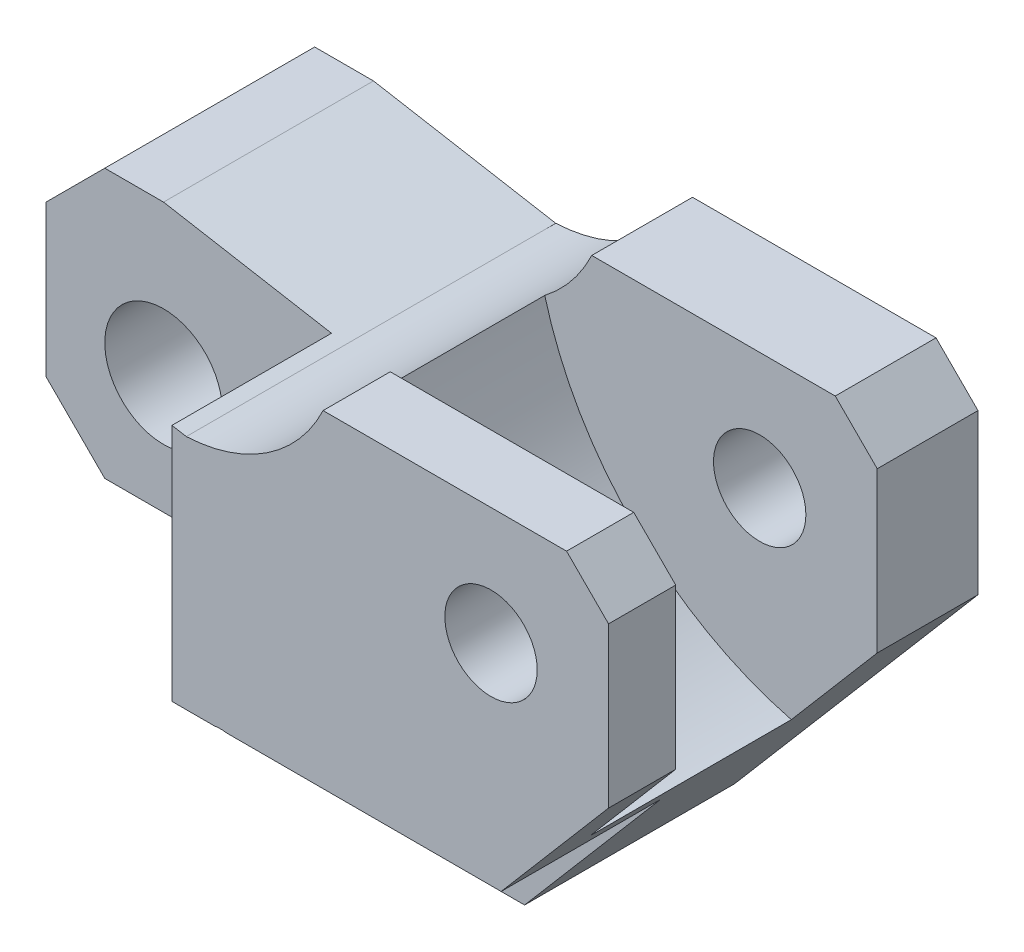
ISO-10303-21;
HEADER;
FILE_DESCRIPTION(('STEP AP214'),'2;1');
FILE_NAME('part.step','',(''),(''),'','','');
FILE_SCHEMA(('AUTOMOTIVE_DESIGN { 1 0 10303 214 1 1 1 1 }'));
ENDSEC;
DATA;
#1=APPLICATION_CONTEXT('core data for automotive mechanical design processes');
#2=APPLICATION_PROTOCOL_DEFINITION('international standard','automotive_design',2000,#1);
#3=PRODUCT_CONTEXT('',#1,'mechanical');
#4=PRODUCT('Part','Part','',(#3));
#5=PRODUCT_RELATED_PRODUCT_CATEGORY('part','',(#4));
#6=PRODUCT_DEFINITION_FORMATION('','',#4);
#7=PRODUCT_DEFINITION_CONTEXT('part definition',#1,'design');
#8=PRODUCT_DEFINITION('design','',#6,#7);
#9=PRODUCT_DEFINITION_SHAPE('','',#8);
#10=(LENGTH_UNIT() NAMED_UNIT(*) SI_UNIT(.MILLI.,.METRE.));
#11=(NAMED_UNIT(*) PLANE_ANGLE_UNIT() SI_UNIT($,.RADIAN.));
#12=(NAMED_UNIT(*) SI_UNIT($,.STERADIAN.) SOLID_ANGLE_UNIT());
#13=UNCERTAINTY_MEASURE_WITH_UNIT(LENGTH_MEASURE(1.E-05),#10,'distance_accuracy_value','');
#14=(GEOMETRIC_REPRESENTATION_CONTEXT(3) GLOBAL_UNCERTAINTY_ASSIGNED_CONTEXT((#13)) GLOBAL_UNIT_ASSIGNED_CONTEXT((#10,
#11,#12)) REPRESENTATION_CONTEXT('',''));
#15=CARTESIAN_POINT('',(0.,0.,0.));
#16=DIRECTION('',(0.,0.,1.));
#17=DIRECTION('',(1.,0.,0.));
#18=AXIS2_PLACEMENT_3D('',#15,#16,#17);
#19=CARTESIAN_POINT('',(103.05549886231,46.2876532524772,12.));
#20=DIRECTION('',(0.,0.,1.));
#21=DIRECTION('',(1.,0.,0.));
#22=AXIS2_PLACEMENT_3D('',#19,#20,#21);
#23=CYLINDRICAL_SURFACE('',#22,41.);
#24=CARTESIAN_POINT('',(103.05549886231,46.2876532524772,36.));
#25=DIRECTION('',(0.,0.,1.));
#26=DIRECTION('',(1.,0.,0.));
#27=AXIS2_PLACEMENT_3D('',#24,#25,#26);
#28=CIRCLE('',#27,41.);
#29=CARTESIAN_POINT('',(63.4564241142946,35.6615872306088,36.));
#30=VERTEX_POINT('',#29);
#31=CARTESIAN_POINT('',(92.8202047446628,6.58577981651378,36.));
#32=VERTEX_POINT('',#31);
#33=EDGE_CURVE('E57',#30,#32,#28,.T.);
#34=ORIENTED_EDGE('',*,*,#33,.T.);
#35=DIRECTION('',(0.,0.,1.));
#36=VECTOR('',#35,1.);
#37=CARTESIAN_POINT('',(92.8202047446628,6.58577981651378,12.));
#38=LINE('',#37,#36);
#39=CARTESIAN_POINT('',(92.8202047446628,6.58577981651378,12.));
#40=VERTEX_POINT('',#39);
#41=EDGE_CURVE('E220',#40,#32,#38,.T.);
#42=ORIENTED_EDGE('',*,*,#41,.F.);
#43=CARTESIAN_POINT('',(103.05549886231,46.2876532524772,12.));
#44=DIRECTION('',(0.,0.,1.));
#45=DIRECTION('',(1.,0.,0.));
#46=AXIS2_PLACEMENT_3D('',#43,#44,#45);
#47=CIRCLE('',#46,41.);
#48=CARTESIAN_POINT('',(63.4564241142946,35.6615872306088,12.));
#49=VERTEX_POINT('',#48);
#50=EDGE_CURVE('E247',#49,#40,#47,.T.);
#51=ORIENTED_EDGE('',*,*,#50,.F.);
#52=DIRECTION('',(0.,0.,1.));
#53=VECTOR('',#52,1.);
#54=CARTESIAN_POINT('',(63.4564241142946,35.6615872306088,12.));
#55=LINE('',#54,#53);
#56=EDGE_CURVE('E53',#49,#30,#55,.T.);
#57=ORIENTED_EDGE('',*,*,#56,.T.);
#58=EDGE_LOOP('',(#34,#42,#51,#57));
#59=FACE_BOUND('',#58,.T.);
#60=ADVANCED_FACE('F36',(#59),#23,.F.);
#61=CARTESIAN_POINT('',(103.05549886231,37.5857798165138,44.));
#62=DIRECTION('',(-1.,0.,0.));
#63=DIRECTION('',(0.,0.,1.));
#64=AXIS2_PLACEMENT_3D('',#61,#62,#63);
#65=PLANE('',#64);
#66=DIRECTION('',(0.,1.,0.));
#67=VECTOR('',#66,1.);
#68=CARTESIAN_POINT('',(103.05549886231,37.5857798165138,12.));
#69=LINE('',#68,#67);
#70=CARTESIAN_POINT('',(103.05549886231,18.5857798165138,12.));
#71=VERTEX_POINT('',#70);
#72=CARTESIAN_POINT('',(103.05549886231,37.5857798165138,12.));
#73=VERTEX_POINT('',#72);
#74=EDGE_CURVE('E252',#71,#73,#69,.T.);
#75=ORIENTED_EDGE('',*,*,#74,.F.);
#76=DIRECTION('',(0.,0.,-1.));
#77=VECTOR('',#76,1.);
#78=CARTESIAN_POINT('',(103.05549886231,18.5857798165138,44.));
#79=LINE('',#78,#77);
#80=CARTESIAN_POINT('',(103.05549886231,18.5857798165138,0.));
#81=VERTEX_POINT('',#80);
#82=EDGE_CURVE('E382',#71,#81,#79,.T.);
#83=ORIENTED_EDGE('',*,*,#82,.T.);
#84=DIRECTION('',(0.,1.,0.));
#85=VECTOR('',#84,1.);
#86=CARTESIAN_POINT('',(103.05549886231,37.5857798165138,0.));
#87=LINE('',#86,#85);
#88=CARTESIAN_POINT('',(103.05549886231,37.5857798165138,0.));
#89=VERTEX_POINT('',#88);
#90=EDGE_CURVE('E334',#81,#89,#87,.T.);
#91=ORIENTED_EDGE('',*,*,#90,.T.);
#92=DIRECTION('',(0.,0.,-1.));
#93=VECTOR('',#92,1.);
#94=CARTESIAN_POINT('',(103.05549886231,37.5857798165138,44.));
#95=LINE('',#94,#93);
#96=EDGE_CURVE('E380',#73,#89,#95,.T.);
#97=ORIENTED_EDGE('',*,*,#96,.F.);
#98=EDGE_LOOP('',(#75,#83,#91,#97));
#99=FACE_BOUND('',#98,.T.);
#100=ADVANCED_FACE('F414',(#99),#65,.F.);
#101=CARTESIAN_POINT('',(98.0554988623098,42.5857798165138,44.));
#102=DIRECTION('',(-0.707106781186544,-0.707106781186551,0.));
#103=DIRECTION('',(0.707106781186551,-0.707106781186544,0.));
#104=AXIS2_PLACEMENT_3D('',#101,#102,#103);
#105=PLANE('',#104);
#106=DIRECTION('',(-0.707106781186551,0.707106781186544,0.));
#107=VECTOR('',#106,1.);
#108=CARTESIAN_POINT('',(98.0554988623098,42.5857798165138,12.));
#109=LINE('',#108,#107);
#110=CARTESIAN_POINT('',(98.0554988623098,42.5857798165138,12.));
#111=VERTEX_POINT('',#110);
#112=EDGE_CURVE('E254',#73,#111,#109,.T.);
#113=ORIENTED_EDGE('',*,*,#112,.F.);
#114=ORIENTED_EDGE('',*,*,#96,.T.);
#115=DIRECTION('',(-0.707106781186551,0.707106781186544,0.));
#116=VECTOR('',#115,1.);
#117=CARTESIAN_POINT('',(98.0554988623098,42.5857798165138,0.));
#118=LINE('',#117,#116);
#119=CARTESIAN_POINT('',(98.0554988623098,42.5857798165138,0.));
#120=VERTEX_POINT('',#119);
#121=EDGE_CURVE('E337',#89,#120,#118,.T.);
#122=ORIENTED_EDGE('',*,*,#121,.T.);
#123=DIRECTION('',(0.,0.,-1.));
#124=VECTOR('',#123,1.);
#125=CARTESIAN_POINT('',(98.0554988623098,42.5857798165138,44.));
#126=LINE('',#125,#124);
#127=EDGE_CURVE('E378',#111,#120,#126,.T.);
#128=ORIENTED_EDGE('',*,*,#127,.F.);
#129=EDGE_LOOP('',(#113,#114,#122,#128));
#130=FACE_BOUND('',#129,.T.);
#131=ADVANCED_FACE('F408',(#130),#105,.F.);
#132=CARTESIAN_POINT('',(69.0554988623098,42.5857798165138,44.));
#133=DIRECTION('',(0.,-1.,0.));
#134=DIRECTION('',(0.,0.,-1.));
#135=AXIS2_PLACEMENT_3D('',#132,#133,#134);
#136=PLANE('',#135);
#137=DIRECTION('',(-1.,0.,0.));
#138=VECTOR('',#137,1.);
#139=CARTESIAN_POINT('',(69.0554988623098,42.5857798165138,12.));
#140=LINE('',#139,#138);
#141=CARTESIAN_POINT('',(69.0554988623098,42.5857798165138,12.));
#142=VERTEX_POINT('',#141);
#143=EDGE_CURVE('E256',#111,#142,#140,.T.);
#144=ORIENTED_EDGE('',*,*,#143,.F.);
#145=ORIENTED_EDGE('',*,*,#127,.T.);
#146=DIRECTION('',(-1.,0.,0.));
#147=VECTOR('',#146,1.);
#148=CARTESIAN_POINT('',(69.0554988623098,42.5857798165138,0.));
#149=LINE('',#148,#147);
#150=CARTESIAN_POINT('',(69.0554988623098,42.5857798165138,0.));
#151=VERTEX_POINT('',#150);
#152=EDGE_CURVE('E340',#120,#151,#149,.T.);
#153=ORIENTED_EDGE('',*,*,#152,.T.);
#154=DIRECTION('',(0.,0.,-1.));
#155=VECTOR('',#154,1.);
#156=CARTESIAN_POINT('',(69.0554988623098,42.5857798165138,44.));
#157=LINE('',#156,#155);
#158=EDGE_CURVE('E376',#142,#151,#157,.T.);
#159=ORIENTED_EDGE('',*,*,#158,.F.);
#160=EDGE_LOOP('',(#144,#145,#153,#159));
#161=FACE_BOUND('',#160,.T.);
#162=ADVANCED_FACE('F398',(#161),#136,.F.);
#163=CARTESIAN_POINT('',(89.0554988623098,28.5857798165138,-6.00000000000001));
#164=DIRECTION('',(0.,0.,1.));
#165=DIRECTION('',(1.,0.,0.));
#166=AXIS2_PLACEMENT_3D('',#163,#164,#165);
#167=CYLINDRICAL_SURFACE('',#166,5.5);
#168=CARTESIAN_POINT('',(89.0554988623098,28.5857798165138,0.));
#169=DIRECTION('',(0.,0.,-1.));
#170=DIRECTION('',(-1.,0.,0.));
#171=AXIS2_PLACEMENT_3D('',#168,#169,#170);
#172=CIRCLE('',#171,5.5);
#173=CARTESIAN_POINT('',(83.5554988623098,28.5857798165138,0.));
#174=VERTEX_POINT('',#173);
#175=EDGE_CURVE('E280',#174,#174,#172,.T.);
#176=ORIENTED_EDGE('',*,*,#175,.T.);
#177=EDGE_LOOP('',(#176));
#178=FACE_BOUND('',#177,.T.);
#179=CARTESIAN_POINT('',(89.0554988623098,28.5857798165138,12.));
#180=DIRECTION('',(0.,0.,1.));
#181=DIRECTION('',(1.,0.,0.));
#182=AXIS2_PLACEMENT_3D('',#179,#180,#181);
#183=CIRCLE('',#182,5.5);
#184=CARTESIAN_POINT('',(94.5554988623098,28.5857798165138,12.));
#185=VERTEX_POINT('',#184);
#186=EDGE_CURVE('E259',#185,#185,#183,.F.);
#187=ORIENTED_EDGE('',*,*,#186,.F.);
#188=EDGE_LOOP('',(#187));
#189=FACE_BOUND('',#188,.T.);
#190=ADVANCED_FACE('F395',(#178,#189),#167,.F.);
#191=CARTESIAN_POINT('',(31.0554988623098,35.5857798165138,44.));
#192=DIRECTION('',(0.,-1.,0.));
#193=DIRECTION('',(0.,0.,-1.));
#194=AXIS2_PLACEMENT_3D('',#191,#192,#193);
#195=PLANE('',#194);
#196=DIRECTION('',(-1.,0.,0.));
#197=VECTOR('',#196,1.);
#198=CARTESIAN_POINT('',(31.0554988623098,35.5857798165138,25.));
#199=LINE('',#198,#197);
#200=CARTESIAN_POINT('',(31.0554988623098,35.5857798165138,25.));
#201=VERTEX_POINT('',#200);
#202=CARTESIAN_POINT('',(24.0554988623098,35.5857798165138,25.));
#203=VERTEX_POINT('',#202);
#204=EDGE_CURVE('E296',#201,#203,#199,.T.);
#205=ORIENTED_EDGE('',*,*,#204,.F.);
#206=DIRECTION('',(0.,0.,-1.));
#207=VECTOR('',#206,1.);
#208=CARTESIAN_POINT('',(31.0554988623098,35.5857798165138,44.));
#209=LINE('',#208,#207);
#210=CARTESIAN_POINT('',(31.0554988623098,35.5857798165138,0.));
#211=VERTEX_POINT('',#210);
#212=EDGE_CURVE('E371',#201,#211,#209,.T.);
#213=ORIENTED_EDGE('',*,*,#212,.T.);
#214=DIRECTION('',(-1.,0.,0.));
#215=VECTOR('',#214,1.);
#216=CARTESIAN_POINT('',(31.0554988623098,35.5857798165138,0.));
#217=LINE('',#216,#215);
#218=CARTESIAN_POINT('',(24.0554988623098,35.5857798165138,0.));
#219=VERTEX_POINT('',#218);
#220=EDGE_CURVE('E348',#211,#219,#217,.T.);
#221=ORIENTED_EDGE('',*,*,#220,.T.);
#222=DIRECTION('',(0.,0.,-1.));
#223=VECTOR('',#222,1.);
#224=CARTESIAN_POINT('',(24.0554988623098,35.5857798165138,44.));
#225=LINE('',#224,#223);
#226=EDGE_CURVE('E369',#203,#219,#225,.T.);
#227=ORIENTED_EDGE('',*,*,#226,.F.);
#228=EDGE_LOOP('',(#205,#213,#221,#227));
#229=FACE_BOUND('',#228,.T.);
#230=ADVANCED_FACE('F397',(#229),#195,.F.);
#231=CARTESIAN_POINT('',(24.0554988623098,35.5857798165138,44.));
#232=DIRECTION('',(0.707106781186547,-0.707106781186548,0.));
#233=DIRECTION('',(0.707106781186548,0.707106781186547,0.));
#234=AXIS2_PLACEMENT_3D('',#231,#232,#233);
#235=PLANE('',#234);
#236=DIRECTION('',(-0.707106781186548,-0.707106781186547,0.));
#237=VECTOR('',#236,1.);
#238=CARTESIAN_POINT('',(24.0554988623098,35.5857798165138,25.));
#239=LINE('',#238,#237);
#240=CARTESIAN_POINT('',(17.0554988623098,28.5857798165138,25.));
#241=VERTEX_POINT('',#240);
#242=EDGE_CURVE('E281',#203,#241,#239,.T.);
#243=ORIENTED_EDGE('',*,*,#242,.F.);
#244=ORIENTED_EDGE('',*,*,#226,.T.);
#245=DIRECTION('',(-0.707106781186548,-0.707106781186547,0.));
#246=VECTOR('',#245,1.);
#247=CARTESIAN_POINT('',(24.0554988623098,35.5857798165138,0.));
#248=LINE('',#247,#246);
#249=CARTESIAN_POINT('',(17.0554988623098,28.5857798165138,0.));
#250=VERTEX_POINT('',#249);
#251=EDGE_CURVE('E351',#219,#250,#248,.T.);
#252=ORIENTED_EDGE('',*,*,#251,.T.);
#253=DIRECTION('',(0.,0.,-1.));
#254=VECTOR('',#253,1.);
#255=CARTESIAN_POINT('',(17.0554988623098,28.5857798165138,44.));
#256=LINE('',#255,#254);
#257=EDGE_CURVE('E367',#241,#250,#256,.T.);
#258=ORIENTED_EDGE('',*,*,#257,.F.);
#259=EDGE_LOOP('',(#243,#244,#252,#258));
#260=FACE_BOUND('',#259,.T.);
#261=ADVANCED_FACE('F405',(#260),#235,.F.);
#262=CARTESIAN_POINT('',(17.0554988623098,28.5857798165138,44.));
#263=DIRECTION('',(1.,0.,0.));
#264=DIRECTION('',(0.,0.,-1.));
#265=AXIS2_PLACEMENT_3D('',#262,#263,#264);
#266=PLANE('',#265);
#267=DIRECTION('',(0.,-1.,0.));
#268=VECTOR('',#267,1.);
#269=CARTESIAN_POINT('',(17.0554988623098,28.5857798165138,25.));
#270=LINE('',#269,#268);
#271=CARTESIAN_POINT('',(17.0554988623098,10.5857798165138,25.));
#272=VERTEX_POINT('',#271);
#273=EDGE_CURVE('E283',#241,#272,#270,.T.);
#274=ORIENTED_EDGE('',*,*,#273,.F.);
#275=ORIENTED_EDGE('',*,*,#257,.T.);
#276=DIRECTION('',(0.,-1.,0.));
#277=VECTOR('',#276,1.);
#278=CARTESIAN_POINT('',(17.0554988623098,28.5857798165138,0.));
#279=LINE('',#278,#277);
#280=CARTESIAN_POINT('',(17.0554988623098,10.5857798165138,0.));
#281=VERTEX_POINT('',#280);
#282=EDGE_CURVE('E354',#250,#281,#279,.T.);
#283=ORIENTED_EDGE('',*,*,#282,.T.);
#284=DIRECTION('',(0.,0.,-1.));
#285=VECTOR('',#284,1.);
#286=CARTESIAN_POINT('',(17.0554988623098,10.5857798165138,44.));
#287=LINE('',#286,#285);
#288=EDGE_CURVE('E365',#272,#281,#287,.T.);
#289=ORIENTED_EDGE('',*,*,#288,.F.);
#290=EDGE_LOOP('',(#274,#275,#283,#289));
#291=FACE_BOUND('',#290,.T.);
#292=ADVANCED_FACE('F526',(#291),#266,.F.);
#293=CARTESIAN_POINT('',(17.0554988623098,10.5857798165138,44.));
#294=DIRECTION('',(0.707106781186548,0.707106781186547,0.));
#295=DIRECTION('',(-0.707106781186547,0.707106781186548,0.));
#296=AXIS2_PLACEMENT_3D('',#293,#294,#295);
#297=PLANE('',#296);
#298=DIRECTION('',(0.707106781186547,-0.707106781186548,0.));
#299=VECTOR('',#298,1.);
#300=CARTESIAN_POINT('',(17.0554988623098,10.5857798165138,25.));
#301=LINE('',#300,#299);
#302=CARTESIAN_POINT('',(24.0554988623098,3.58577981651377,25.));
#303=VERTEX_POINT('',#302);
#304=EDGE_CURVE('E286',#272,#303,#301,.T.);
#305=ORIENTED_EDGE('',*,*,#304,.F.);
#306=ORIENTED_EDGE('',*,*,#288,.T.);
#307=DIRECTION('',(0.707106781186547,-0.707106781186548,0.));
#308=VECTOR('',#307,1.);
#309=CARTESIAN_POINT('',(17.0554988623098,10.5857798165138,0.));
#310=LINE('',#309,#308);
#311=CARTESIAN_POINT('',(24.0554988623098,3.58577981651377,0.));
#312=VERTEX_POINT('',#311);
#313=EDGE_CURVE('E357',#281,#312,#310,.T.);
#314=ORIENTED_EDGE('',*,*,#313,.T.);
#315=DIRECTION('',(0.,0.,-1.));
#316=VECTOR('',#315,1.);
#317=CARTESIAN_POINT('',(24.0554988623098,3.58577981651377,44.));
#318=LINE('',#317,#316);
#319=EDGE_CURVE('E363',#303,#312,#318,.T.);
#320=ORIENTED_EDGE('',*,*,#319,.F.);
#321=EDGE_LOOP('',(#305,#306,#314,#320));
#322=FACE_BOUND('',#321,.T.);
#323=ADVANCED_FACE('F523',(#322),#297,.F.);
#324=CARTESIAN_POINT('',(31.0554988623098,17.5857798165138,0.));
#325=DIRECTION('',(0.,0.,1.));
#326=DIRECTION('',(1.,0.,0.));
#327=AXIS2_PLACEMENT_3D('',#324,#325,#326);
#328=CYLINDRICAL_SURFACE('',#327,7.);
#329=CARTESIAN_POINT('',(31.0554988623098,17.5857798165138,0.));
#330=DIRECTION('',(0.,0.,1.));
#331=DIRECTION('',(1.,0.,0.));
#332=AXIS2_PLACEMENT_3D('',#329,#330,#331);
#333=CIRCLE('',#332,7.);
#334=CARTESIAN_POINT('',(38.0554988623098,17.5857798165138,0.));
#335=VERTEX_POINT('',#334);
#336=EDGE_CURVE('E305',#335,#335,#333,.T.);
#337=ORIENTED_EDGE('',*,*,#336,.F.);
#338=EDGE_LOOP('',(#337));
#339=FACE_BOUND('',#338,.T.);
#340=CARTESIAN_POINT('',(31.0554988623098,17.5857798165138,25.));
#341=DIRECTION('',(0.,0.,1.));
#342=DIRECTION('',(1.,0.,0.));
#343=AXIS2_PLACEMENT_3D('',#340,#341,#342);
#344=CIRCLE('',#343,7.);
#345=CARTESIAN_POINT('',(38.0554988623098,17.5857798165138,25.));
#346=VERTEX_POINT('',#345);
#347=EDGE_CURVE('E303',#346,#346,#344,.F.);
#348=ORIENTED_EDGE('',*,*,#347,.F.);
#349=EDGE_LOOP('',(#348));
#350=FACE_BOUND('',#349,.T.);
#351=ADVANCED_FACE('F520',(#339,#350),#328,.F.);
#352=CARTESIAN_POINT('',(56.8344819672813,-1.35316595380695,44.));
#353=DIRECTION('',(0.,0.,-1.));
#354=DIRECTION('',(-1.,0.,0.));
#355=AXIS2_PLACEMENT_3D('',#352,#353,#354);
#356=CYLINDRICAL_SURFACE('',#355,5.);
#357=CARTESIAN_POINT('',(56.8344819672813,-1.35316595380695,25.));
#358=DIRECTION('',(0.,0.,-1.));
#359=DIRECTION('',(-1.,0.,0.));
#360=AXIS2_PLACEMENT_3D('',#357,#358,#359);
#361=CIRCLE('',#360,5.);
#362=CARTESIAN_POINT('',(61.7971613747948,-1.96293074308323,25.));
#363=VERTEX_POINT('',#362);
#364=CARTESIAN_POINT('',(57.6134650722527,3.58577981651378,25.));
#365=VERTEX_POINT('',#364);
#366=EDGE_CURVE('E277',#363,#365,#361,.F.);
#367=ORIENTED_EDGE('',*,*,#366,.T.);
#368=DIRECTION('',(0.,0.,-1.));
#369=VECTOR('',#368,1.);
#370=CARTESIAN_POINT('',(57.6134650722527,3.58577981651378,44.));
#371=LINE('',#370,#369);
#372=CARTESIAN_POINT('',(57.6134650722527,3.58577981651378,44.));
#373=VERTEX_POINT('',#372);
#374=EDGE_CURVE('E274',#365,#373,#371,.F.);
#375=ORIENTED_EDGE('',*,*,#374,.T.);
#376=CARTESIAN_POINT('',(56.8344819672813,-1.35316595380695,44.));
#377=DIRECTION('',(0.,0.,-1.));
#378=DIRECTION('',(-1.,0.,0.));
#379=AXIS2_PLACEMENT_3D('',#376,#377,#378);
#380=CIRCLE('',#379,5.);
#381=CARTESIAN_POINT('',(56.0554988623098,3.58577981651377,44.));
#382=VERTEX_POINT('',#381);
#383=EDGE_CURVE('E309',#382,#373,#380,.T.);
#384=ORIENTED_EDGE('',*,*,#383,.F.);
#385=DIRECTION('',(0.,0.,-1.));
#386=VECTOR('',#385,1.);
#387=CARTESIAN_POINT('',(56.0554988623098,3.58577981651377,44.));
#388=LINE('',#387,#386);
#389=CARTESIAN_POINT('',(56.0554988623098,3.58577981651377,0.));
#390=VERTEX_POINT('',#389);
#391=EDGE_CURVE('E322',#382,#390,#388,.T.);
#392=ORIENTED_EDGE('',*,*,#391,.T.);
#393=CARTESIAN_POINT('',(56.8344819672813,-1.35316595380695,0.));
#394=DIRECTION('',(0.,0.,-1.));
#395=DIRECTION('',(-1.,0.,0.));
#396=AXIS2_PLACEMENT_3D('',#393,#394,#395);
#397=CIRCLE('',#396,5.);
#398=CARTESIAN_POINT('',(61.7971613747948,-1.96293074308324,0.));
#399=VERTEX_POINT('',#398);
#400=EDGE_CURVE('E308',#390,#399,#397,.T.);
#401=ORIENTED_EDGE('',*,*,#400,.T.);
#402=DIRECTION('',(0.,0.,-1.));
#403=VECTOR('',#402,1.);
#404=CARTESIAN_POINT('',(61.7971613747948,-1.96293074308324,44.));
#405=LINE('',#404,#403);
#406=EDGE_CURVE('E11',#363,#399,#405,.T.);
#407=ORIENTED_EDGE('',*,*,#406,.F.);
#408=EDGE_LOOP('',(#367,#375,#384,#392,#401,#407));
#409=FACE_BOUND('',#408,.T.);
#410=ADVANCED_FACE('F38',(#409),#356,.F.);
#411=CARTESIAN_POINT('',(90.261381215251,3.58577981651377,44.));
#412=DIRECTION('',(0.,0.,-1.));
#413=DIRECTION('',(-1.,0.,0.));
#414=AXIS2_PLACEMENT_3D('',#411,#412,#413);
#415=CYLINDRICAL_SURFACE('',#414,29.);
#416=DIRECTION('',(0.,0.,-1.));
#417=VECTOR('',#416,1.);
#418=CARTESIAN_POINT('',(68.3524789150443,-15.4142201834862,44.));
#419=LINE('',#418,#417);
#420=CARTESIAN_POINT('',(68.3524789150443,-15.4142201834862,25.));
#421=VERTEX_POINT('',#420);
#422=CARTESIAN_POINT('',(68.3524789150443,-15.4142201834862,0.));
#423=VERTEX_POINT('',#422);
#424=EDGE_CURVE('E45',#421,#423,#419,.T.);
#425=ORIENTED_EDGE('',*,*,#424,.F.);
#426=CARTESIAN_POINT('',(90.261381215251,3.58577981651378,25.));
#427=DIRECTION('',(0.,0.,1.));
#428=DIRECTION('',(1.,0.,0.));
#429=AXIS2_PLACEMENT_3D('',#426,#427,#428);
#430=CIRCLE('',#429,29.);
#431=EDGE_CURVE('E261',#363,#421,#430,.T.);
#432=ORIENTED_EDGE('',*,*,#431,.F.);
#433=ORIENTED_EDGE('',*,*,#406,.T.);
#434=CARTESIAN_POINT('',(90.261381215251,3.58577981651377,0.));
#435=DIRECTION('',(0.,0.,1.));
#436=DIRECTION('',(1.,0.,0.));
#437=AXIS2_PLACEMENT_3D('',#434,#435,#436);
#438=CIRCLE('',#437,29.);
#439=EDGE_CURVE('E325',#399,#423,#438,.T.);
#440=ORIENTED_EDGE('',*,*,#439,.T.);
#441=EDGE_LOOP('',(#425,#432,#433,#440));
#442=FACE_BOUND('',#441,.T.);
#443=ADVANCED_FACE('F450',(#442),#415,.T.);
#444=CARTESIAN_POINT('',(74.0554988623098,-15.4142201834862,44.));
#445=DIRECTION('',(0.,1.,0.));
#446=DIRECTION('',(-1.,0.,0.));
#447=AXIS2_PLACEMENT_3D('',#444,#445,#446);
#448=PLANE('',#447);
#449=DIRECTION('',(0.,0.,-1.));
#450=VECTOR('',#449,1.);
#451=CARTESIAN_POINT('',(74.0554988623098,-15.4142201834862,44.));
#452=LINE('',#451,#450);
#453=CARTESIAN_POINT('',(74.0554988623098,-15.4142201834862,25.));
#454=VERTEX_POINT('',#453);
#455=CARTESIAN_POINT('',(74.0554988623098,-15.4142201834862,0.));
#456=VERTEX_POINT('',#455);
#457=EDGE_CURVE('E384',#454,#456,#452,.T.);
#458=ORIENTED_EDGE('',*,*,#457,.F.);
#459=DIRECTION('',(1.,0.,0.));
#460=VECTOR('',#459,1.);
#461=CARTESIAN_POINT('',(74.0554988623098,-15.4142201834862,25.));
#462=LINE('',#461,#460);
#463=EDGE_CURVE('E263',#421,#454,#462,.T.);
#464=ORIENTED_EDGE('',*,*,#463,.F.);
#465=ORIENTED_EDGE('',*,*,#424,.T.);
#466=DIRECTION('',(1.,0.,0.));
#467=VECTOR('',#466,1.);
#468=CARTESIAN_POINT('',(74.0554988623098,-15.4142201834862,0.));
#469=LINE('',#468,#467);
#470=EDGE_CURVE('E328',#423,#456,#469,.T.);
#471=ORIENTED_EDGE('',*,*,#470,.T.);
#472=EDGE_LOOP('',(#458,#464,#465,#471));
#473=FACE_BOUND('',#472,.T.);
#474=ADVANCED_FACE('F454',(#473),#448,.F.);
#475=CARTESIAN_POINT('',(103.05549886231,18.5857798165138,44.));
#476=DIRECTION('',(-0.760833951959086,0.64894660608275,0.));
#477=DIRECTION('',(-0.64894660608275,-0.760833951959086,0.));
#478=AXIS2_PLACEMENT_3D('',#475,#476,#477);
#479=PLANE('',#478);
#480=DIRECTION('',(0.64894660608275,0.760833951959086,0.));
#481=VECTOR('',#480,1.);
#482=CARTESIAN_POINT('',(103.05549886231,18.5857798165138,12.));
#483=LINE('',#482,#481);
#484=EDGE_CURVE('E250',#40,#71,#483,.T.);
#485=ORIENTED_EDGE('',*,*,#484,.F.);
#486=ORIENTED_EDGE('',*,*,#41,.T.);
#487=DIRECTION('',(0.648946606082749,0.760833951959086,0.));
#488=VECTOR('',#487,1.);
#489=CARTESIAN_POINT('',(92.8202047446628,6.58577981651378,36.));
#490=LINE('',#489,#488);
#491=CARTESIAN_POINT('',(103.05549886231,18.5857798165138,36.));
#492=VERTEX_POINT('',#491);
#493=EDGE_CURVE('E213',#32,#492,#490,.T.);
#494=ORIENTED_EDGE('',*,*,#493,.T.);
#495=DIRECTION('',(0.,0.,1.));
#496=VECTOR('',#495,1.);
#497=CARTESIAN_POINT('',(103.05549886231,18.5857798165138,36.));
#498=LINE('',#497,#496);
#499=CARTESIAN_POINT('',(103.05549886231,18.5857798165138,44.));
#500=VERTEX_POINT('',#499);
#501=EDGE_CURVE('E197',#492,#500,#498,.T.);
#502=ORIENTED_EDGE('',*,*,#501,.T.);
#503=DIRECTION('',(0.64894660608275,0.760833951959086,0.));
#504=VECTOR('',#503,1.);
#505=CARTESIAN_POINT('',(103.05549886231,18.5857798165138,44.));
#506=LINE('',#505,#504);
#507=CARTESIAN_POINT('',(90.261381215251,3.58577981651378,44.));
#508=VERTEX_POINT('',#507);
#509=EDGE_CURVE('E312',#508,#500,#506,.T.);
#510=ORIENTED_EDGE('',*,*,#509,.F.);
#511=DIRECTION('',(0.,0.,1.));
#512=VECTOR('',#511,1.);
#513=CARTESIAN_POINT('',(90.261381215251,3.58577981651378,25.));
#514=LINE('',#513,#512);
#515=CARTESIAN_POINT('',(90.261381215251,3.58577981651378,25.));
#516=VERTEX_POINT('',#515);
#517=EDGE_CURVE('E271',#516,#508,#514,.T.);
#518=ORIENTED_EDGE('',*,*,#517,.F.);
#519=DIRECTION('',(0.64894660608275,0.760833951959086,0.));
#520=VECTOR('',#519,1.);
#521=CARTESIAN_POINT('',(90.261381215251,3.58577981651378,25.));
#522=LINE('',#521,#520);
#523=EDGE_CURVE('E266',#454,#516,#522,.T.);
#524=ORIENTED_EDGE('',*,*,#523,.F.);
#525=ORIENTED_EDGE('',*,*,#457,.T.);
#526=DIRECTION('',(0.64894660608275,0.760833951959086,0.));
#527=VECTOR('',#526,1.);
#528=CARTESIAN_POINT('',(103.05549886231,18.5857798165138,0.));
#529=LINE('',#528,#527);
#530=EDGE_CURVE('E331',#456,#81,#529,.T.);
#531=ORIENTED_EDGE('',*,*,#530,.T.);
#532=ORIENTED_EDGE('',*,*,#82,.F.);
#533=EDGE_LOOP('',(#485,#486,#494,#502,#510,#518,#524,#525,#531,#532));
#534=FACE_BOUND('',#533,.T.);
#535=ADVANCED_FACE('F219',(#534),#479,.F.);
#536=CARTESIAN_POINT('',(51.8931885257494,50.7377798110915,44.));
#537=DIRECTION('',(0.,0.,-1.));
#538=DIRECTION('',(-1.,0.,0.));
#539=AXIS2_PLACEMENT_3D('',#536,#537,#538);
#540=CYLINDRICAL_SURFACE('',#539,19.);
#541=CARTESIAN_POINT('',(51.8931885257494,50.7377798110915,44.));
#542=DIRECTION('',(0.,0.,-1.));
#543=DIRECTION('',(-1.,0.,0.));
#544=AXIS2_PLACEMENT_3D('',#541,#542,#543);
#545=CIRCLE('',#544,19.);
#546=CARTESIAN_POINT('',(69.0554988623098,42.5857798165138,44.));
#547=VERTEX_POINT('',#546);
#548=CARTESIAN_POINT('',(52.7650774955101,31.7577953636687,44.));
#549=VERTEX_POINT('',#548);
#550=EDGE_CURVE('E315',#547,#549,#545,.T.);
#551=ORIENTED_EDGE('',*,*,#550,.F.);
#552=DIRECTION('',(0.,0.,1.));
#553=VECTOR('',#552,1.);
#554=CARTESIAN_POINT('',(69.0554988623098,42.5857798165138,36.));
#555=LINE('',#554,#553);
#556=CARTESIAN_POINT('',(69.0554988623098,42.5857798165138,36.));
#557=VERTEX_POINT('',#556);
#558=EDGE_CURVE('E238',#557,#547,#555,.T.);
#559=ORIENTED_EDGE('',*,*,#558,.F.);
#560=CARTESIAN_POINT('',(51.8931885257484,50.7377798110923,36.));
#561=DIRECTION('',(0.,0.,-1.));
#562=DIRECTION('',(1.,0.,0.));
#563=AXIS2_PLACEMENT_3D('',#560,#561,#562);
#564=CIRCLE('',#563,19.0000000000013);
#565=EDGE_CURVE('E207',#557,#30,#564,.T.);
#566=ORIENTED_EDGE('',*,*,#565,.T.);
#567=ORIENTED_EDGE('',*,*,#56,.F.);
#568=CARTESIAN_POINT('',(51.8931885257488,50.737779811092,12.));
#569=DIRECTION('',(0.,0.,-1.));
#570=DIRECTION('',(1.,0.,0.));
#571=AXIS2_PLACEMENT_3D('',#568,#569,#570);
#572=CIRCLE('',#571,19.0000000000008);
#573=EDGE_CURVE('E241',#142,#49,#572,.T.);
#574=ORIENTED_EDGE('',*,*,#573,.F.);
#575=ORIENTED_EDGE('',*,*,#158,.T.);
#576=CARTESIAN_POINT('',(51.8931885257494,50.7377798110915,0.));
#577=DIRECTION('',(0.,0.,-1.));
#578=DIRECTION('',(-1.,0.,0.));
#579=AXIS2_PLACEMENT_3D('',#576,#577,#578);
#580=CIRCLE('',#579,19.);
#581=CARTESIAN_POINT('',(52.7650774955101,31.7577953636687,0.));
#582=VERTEX_POINT('',#581);
#583=EDGE_CURVE('E343',#151,#582,#580,.T.);
#584=ORIENTED_EDGE('',*,*,#583,.T.);
#585=DIRECTION('',(0.,0.,-1.));
#586=VECTOR('',#585,1.);
#587=CARTESIAN_POINT('',(52.7650774955101,31.7577953636687,44.));
#588=LINE('',#587,#586);
#589=EDGE_CURVE('E373',#549,#582,#588,.T.);
#590=ORIENTED_EDGE('',*,*,#589,.F.);
#591=EDGE_LOOP('',(#551,#559,#566,#567,#574,#575,#584,#590));
#592=FACE_BOUND('',#591,.T.);
#593=ADVANCED_FACE('F473',(#592),#540,.F.);
#594=CARTESIAN_POINT('',(31.0554988623098,35.5857798165138,44.));
#595=DIRECTION('',(-0.173648177666924,-0.984807753012209,0.));
#596=DIRECTION('',(0.984807753012209,-0.173648177666924,0.));
#597=AXIS2_PLACEMENT_3D('',#594,#595,#596);
#598=PLANE('',#597);
#599=DIRECTION('',(-0.984807753012209,0.173648177666923,0.));
#600=VECTOR('',#599,1.);
#601=CARTESIAN_POINT('',(51.0554988623098,32.0592402023446,25.));
#602=LINE('',#601,#600);
#603=CARTESIAN_POINT('',(51.0554988623098,32.0592402023446,25.));
#604=VERTEX_POINT('',#603);
#605=EDGE_CURVE('E294',#604,#201,#602,.T.);
#606=ORIENTED_EDGE('',*,*,#605,.F.);
#607=DIRECTION('',(0.,0.,1.));
#608=VECTOR('',#607,1.);
#609=CARTESIAN_POINT('',(51.0554988623098,32.0592402023446,25.));
#610=LINE('',#609,#608);
#611=CARTESIAN_POINT('',(51.0554988623098,32.0592402023446,44.));
#612=VERTEX_POINT('',#611);
#613=EDGE_CURVE('E300',#604,#612,#610,.T.);
#614=ORIENTED_EDGE('',*,*,#613,.T.);
#615=DIRECTION('',(-0.984807753012209,0.173648177666924,0.));
#616=VECTOR('',#615,1.);
#617=CARTESIAN_POINT('',(31.0554988623098,35.5857798165138,44.));
#618=LINE('',#617,#616);
#619=EDGE_CURVE('E317',#549,#612,#618,.T.);
#620=ORIENTED_EDGE('',*,*,#619,.F.);
#621=ORIENTED_EDGE('',*,*,#589,.T.);
#622=DIRECTION('',(-0.984807753012209,0.173648177666924,0.));
#623=VECTOR('',#622,1.);
#624=CARTESIAN_POINT('',(31.0554988623098,35.5857798165138,0.));
#625=LINE('',#624,#623);
#626=EDGE_CURVE('E345',#582,#211,#625,.T.);
#627=ORIENTED_EDGE('',*,*,#626,.T.);
#628=ORIENTED_EDGE('',*,*,#212,.F.);
#629=EDGE_LOOP('',(#606,#614,#620,#621,#627,#628));
#630=FACE_BOUND('',#629,.T.);
#631=ADVANCED_FACE('F516',(#630),#598,.F.);
#632=CARTESIAN_POINT('',(24.0554988623098,3.58577981651377,44.));
#633=DIRECTION('',(0.,1.,0.));
#634=DIRECTION('',(0.,0.,1.));
#635=AXIS2_PLACEMENT_3D('',#632,#633,#634);
#636=PLANE('',#635);
#637=DIRECTION('',(1.,0.,0.));
#638=VECTOR('',#637,1.);
#639=CARTESIAN_POINT('',(24.0554988623098,3.58577981651377,44.));
#640=LINE('',#639,#638);
#641=CARTESIAN_POINT('',(51.0554988623098,3.58577981651377,44.));
#642=VERTEX_POINT('',#641);
#643=EDGE_CURVE('E320',#642,#382,#640,.T.);
#644=ORIENTED_EDGE('',*,*,#643,.F.);
#645=DIRECTION('',(0.,0.,1.));
#646=VECTOR('',#645,1.);
#647=CARTESIAN_POINT('',(51.0554988623098,3.58577981651377,25.));
#648=LINE('',#647,#646);
#649=CARTESIAN_POINT('',(51.0554988623098,3.58577981651377,25.));
#650=VERTEX_POINT('',#649);
#651=EDGE_CURVE('E298',#650,#642,#648,.T.);
#652=ORIENTED_EDGE('',*,*,#651,.F.);
#653=DIRECTION('',(1.,0.,0.));
#654=VECTOR('',#653,1.);
#655=CARTESIAN_POINT('',(24.0554988623098,3.58577981651377,25.));
#656=LINE('',#655,#654);
#657=EDGE_CURVE('E288',#303,#650,#656,.T.);
#658=ORIENTED_EDGE('',*,*,#657,.F.);
#659=ORIENTED_EDGE('',*,*,#319,.T.);
#660=DIRECTION('',(1.,0.,0.));
#661=VECTOR('',#660,1.);
#662=CARTESIAN_POINT('',(24.0554988623098,3.58577981651377,0.));
#663=LINE('',#662,#661);
#664=EDGE_CURVE('E313',#312,#390,#663,.T.);
#665=ORIENTED_EDGE('',*,*,#664,.T.);
#666=ORIENTED_EDGE('',*,*,#391,.F.);
#667=EDGE_LOOP('',(#644,#652,#658,#659,#665,#666));
#668=FACE_BOUND('',#667,.T.);
#669=ADVANCED_FACE('F507',(#668),#636,.F.);
#670=CARTESIAN_POINT('',(56.8344819672813,-1.35316595380695,44.));
#671=DIRECTION('',(0.,0.,-1.));
#672=DIRECTION('',(-1.,0.,0.));
#673=AXIS2_PLACEMENT_3D('',#670,#671,#672);
#674=PLANE('',#673);
#675=CARTESIAN_POINT('',(89.0554988623098,28.5857798165138,44.));
#676=DIRECTION('',(0.,0.,1.));
#677=DIRECTION('',(1.,0.,0.));
#678=AXIS2_PLACEMENT_3D('',#675,#676,#677);
#679=CIRCLE('',#678,5.5);
#680=CARTESIAN_POINT('',(94.5554988623098,28.5857798165138,44.));
#681=VERTEX_POINT('',#680);
#682=EDGE_CURVE('E502',#681,#681,#679,.T.);
#683=ORIENTED_EDGE('',*,*,#682,.F.);
#684=EDGE_LOOP('',(#683));
#685=FACE_BOUND('',#684,.T.);
#686=ORIENTED_EDGE('',*,*,#509,.T.);
#687=DIRECTION('',(0.,1.,0.));
#688=VECTOR('',#687,1.);
#689=CARTESIAN_POINT('',(103.05549886231,18.5857798165138,44.));
#690=LINE('',#689,#688);
#691=CARTESIAN_POINT('',(103.05549886231,37.5857798165138,44.));
#692=VERTEX_POINT('',#691);
#693=EDGE_CURVE('E202',#500,#692,#690,.T.);
#694=ORIENTED_EDGE('',*,*,#693,.T.);
#695=DIRECTION('',(-0.707106781186551,0.707106781186544,0.));
#696=VECTOR('',#695,1.);
#697=CARTESIAN_POINT('',(103.05549886231,37.5857798165138,44.));
#698=LINE('',#697,#696);
#699=CARTESIAN_POINT('',(98.0554988623098,42.5857798165138,44.));
#700=VERTEX_POINT('',#699);
#701=EDGE_CURVE('E233',#692,#700,#698,.T.);
#702=ORIENTED_EDGE('',*,*,#701,.T.);
#703=DIRECTION('',(-1.,0.,0.));
#704=VECTOR('',#703,1.);
#705=CARTESIAN_POINT('',(98.0554988623098,42.5857798165138,44.));
#706=LINE('',#705,#704);
#707=EDGE_CURVE('E222',#700,#547,#706,.T.);
#708=ORIENTED_EDGE('',*,*,#707,.T.);
#709=ORIENTED_EDGE('',*,*,#550,.T.);
#710=ORIENTED_EDGE('',*,*,#619,.T.);
#711=DIRECTION('',(0.,1.,0.));
#712=VECTOR('',#711,1.);
#713=CARTESIAN_POINT('',(51.0554988623098,3.58577981651377,44.));
#714=LINE('',#713,#712);
#715=EDGE_CURVE('E284',#642,#612,#714,.T.);
#716=ORIENTED_EDGE('',*,*,#715,.F.);
#717=ORIENTED_EDGE('',*,*,#643,.T.);
#718=ORIENTED_EDGE('',*,*,#383,.T.);
#719=DIRECTION('',(-1.,0.,0.));
#720=VECTOR('',#719,1.);
#721=CARTESIAN_POINT('',(56.0554988623099,3.58577981651378,44.));
#722=LINE('',#721,#720);
#723=EDGE_CURVE('E264',#508,#373,#722,.T.);
#724=ORIENTED_EDGE('',*,*,#723,.F.);
#725=EDGE_LOOP('',(#686,#694,#702,#708,#709,#710,#716,#717,#718,#724));
#726=FACE_BOUND('',#725,.T.);
#727=ADVANCED_FACE('F442',(#685,#726),#674,.F.);
#728=CARTESIAN_POINT('',(56.8344819672813,-1.35316595380695,0.));
#729=DIRECTION('',(0.,0.,-1.));
#730=DIRECTION('',(-1.,0.,0.));
#731=AXIS2_PLACEMENT_3D('',#728,#729,#730);
#732=PLANE('',#731);
#733=ORIENTED_EDGE('',*,*,#175,.F.);
#734=EDGE_LOOP('',(#733));
#735=FACE_BOUND('',#734,.T.);
#736=ORIENTED_EDGE('',*,*,#336,.T.);
#737=EDGE_LOOP('',(#736));
#738=FACE_BOUND('',#737,.T.);
#739=ORIENTED_EDGE('',*,*,#400,.F.);
#740=ORIENTED_EDGE('',*,*,#664,.F.);
#741=ORIENTED_EDGE('',*,*,#313,.F.);
#742=ORIENTED_EDGE('',*,*,#282,.F.);
#743=ORIENTED_EDGE('',*,*,#251,.F.);
#744=ORIENTED_EDGE('',*,*,#220,.F.);
#745=ORIENTED_EDGE('',*,*,#626,.F.);
#746=ORIENTED_EDGE('',*,*,#583,.F.);
#747=ORIENTED_EDGE('',*,*,#152,.F.);
#748=ORIENTED_EDGE('',*,*,#121,.F.);
#749=ORIENTED_EDGE('',*,*,#90,.F.);
#750=ORIENTED_EDGE('',*,*,#530,.F.);
#751=ORIENTED_EDGE('',*,*,#470,.F.);
#752=ORIENTED_EDGE('',*,*,#439,.F.);
#753=EDGE_LOOP('',(#739,#740,#741,#742,#743,#744,#745,#746,#747,#748,#749,#750,#751,#752));
#754=FACE_BOUND('',#753,.T.);
#755=ADVANCED_FACE('F461',(#735,#738,#754),#732,.T.);
#756=CARTESIAN_POINT('',(0.,0.,25.));
#757=DIRECTION('',(0.,0.,1.));
#758=DIRECTION('',(1.,0.,0.));
#759=AXIS2_PLACEMENT_3D('',#756,#757,#758);
#760=PLANE('',#759);
#761=ORIENTED_EDGE('',*,*,#242,.T.);
#762=ORIENTED_EDGE('',*,*,#273,.T.);
#763=ORIENTED_EDGE('',*,*,#304,.T.);
#764=ORIENTED_EDGE('',*,*,#657,.T.);
#765=DIRECTION('',(0.,1.,0.));
#766=VECTOR('',#765,1.);
#767=CARTESIAN_POINT('',(51.0554988623098,3.58577981651377,25.));
#768=LINE('',#767,#766);
#769=EDGE_CURVE('E291',#650,#604,#768,.T.);
#770=ORIENTED_EDGE('',*,*,#769,.T.);
#771=ORIENTED_EDGE('',*,*,#605,.T.);
#772=ORIENTED_EDGE('',*,*,#204,.T.);
#773=EDGE_LOOP('',(#761,#762,#763,#764,#770,#771,#772));
#774=FACE_BOUND('',#773,.T.);
#775=ORIENTED_EDGE('',*,*,#347,.T.);
#776=EDGE_LOOP('',(#775));
#777=FACE_BOUND('',#776,.T.);
#778=ADVANCED_FACE('F513',(#774,#777),#760,.T.);
#779=CARTESIAN_POINT('',(51.0554988623098,3.58577981651377,25.));
#780=DIRECTION('',(1.,0.,0.));
#781=DIRECTION('',(0.,1.,0.));
#782=AXIS2_PLACEMENT_3D('',#779,#780,#781);
#783=PLANE('',#782);
#784=ORIENTED_EDGE('',*,*,#715,.T.);
#785=ORIENTED_EDGE('',*,*,#613,.F.);
#786=ORIENTED_EDGE('',*,*,#769,.F.);
#787=ORIENTED_EDGE('',*,*,#651,.T.);
#788=EDGE_LOOP('',(#784,#785,#786,#787));
#789=FACE_BOUND('',#788,.T.);
#790=ADVANCED_FACE('F427',(#789),#783,.F.);
#791=CARTESIAN_POINT('',(56.0554988623099,-2.15923757056078,25.));
#792=DIRECTION('',(0.,0.,-1.));
#793=DIRECTION('',(-1.,0.,0.));
#794=AXIS2_PLACEMENT_3D('',#791,#792,#793);
#795=PLANE('',#794);
#796=ORIENTED_EDGE('',*,*,#431,.T.);
#797=ORIENTED_EDGE('',*,*,#463,.T.);
#798=ORIENTED_EDGE('',*,*,#523,.T.);
#799=DIRECTION('',(-1.,0.,0.));
#800=VECTOR('',#799,1.);
#801=CARTESIAN_POINT('',(56.0554988623099,3.58577981651378,25.));
#802=LINE('',#801,#800);
#803=EDGE_CURVE('E268',#516,#365,#802,.T.);
#804=ORIENTED_EDGE('',*,*,#803,.T.);
#805=ORIENTED_EDGE('',*,*,#366,.F.);
#806=EDGE_LOOP('',(#796,#797,#798,#804,#805));
#807=FACE_BOUND('',#806,.T.);
#808=ADVANCED_FACE('F424',(#807),#795,.F.);
#809=CARTESIAN_POINT('',(56.0554988623099,3.58577981651378,25.));
#810=DIRECTION('',(0.,1.,0.));
#811=DIRECTION('',(-1.,0.,0.));
#812=AXIS2_PLACEMENT_3D('',#809,#810,#811);
#813=PLANE('',#812);
#814=ORIENTED_EDGE('',*,*,#803,.F.);
#815=ORIENTED_EDGE('',*,*,#517,.T.);
#816=ORIENTED_EDGE('',*,*,#723,.T.);
#817=ORIENTED_EDGE('',*,*,#374,.F.);
#818=EDGE_LOOP('',(#814,#815,#816,#817));
#819=FACE_BOUND('',#818,.T.);
#820=ADVANCED_FACE('F426',(#819),#813,.F.);
#821=CARTESIAN_POINT('',(51.8931885257488,50.737779811092,12.));
#822=DIRECTION('',(0.,0.,1.));
#823=DIRECTION('',(1.,0.,0.));
#824=AXIS2_PLACEMENT_3D('',#821,#822,#823);
#825=PLANE('',#824);
#826=ORIENTED_EDGE('',*,*,#573,.T.);
#827=ORIENTED_EDGE('',*,*,#50,.T.);
#828=ORIENTED_EDGE('',*,*,#484,.T.);
#829=ORIENTED_EDGE('',*,*,#74,.T.);
#830=ORIENTED_EDGE('',*,*,#112,.T.);
#831=ORIENTED_EDGE('',*,*,#143,.T.);
#832=EDGE_LOOP('',(#826,#827,#828,#829,#830,#831));
#833=FACE_BOUND('',#832,.T.);
#834=ORIENTED_EDGE('',*,*,#186,.T.);
#835=EDGE_LOOP('',(#834));
#836=FACE_BOUND('',#835,.T.);
#837=ADVANCED_FACE('F393',(#833,#836),#825,.T.);
#838=CARTESIAN_POINT('',(98.0554988623098,42.5857798165138,36.));
#839=DIRECTION('',(0.,1.,0.));
#840=DIRECTION('',(-1.,0.,0.));
#841=AXIS2_PLACEMENT_3D('',#838,#839,#840);
#842=PLANE('',#841);
#843=ORIENTED_EDGE('',*,*,#707,.F.);
#844=DIRECTION('',(0.,0.,1.));
#845=VECTOR('',#844,1.);
#846=CARTESIAN_POINT('',(98.0554988623098,42.5857798165138,36.));
#847=LINE('',#846,#845);
#848=CARTESIAN_POINT('',(98.0554988623098,42.5857798165138,36.));
#849=VERTEX_POINT('',#848);
#850=EDGE_CURVE('E242',#849,#700,#847,.T.);
#851=ORIENTED_EDGE('',*,*,#850,.F.);
#852=DIRECTION('',(-1.,0.,0.));
#853=VECTOR('',#852,1.);
#854=CARTESIAN_POINT('',(98.0554988623098,42.5857798165138,36.));
#855=LINE('',#854,#853);
#856=EDGE_CURVE('E227',#849,#557,#855,.T.);
#857=ORIENTED_EDGE('',*,*,#856,.T.);
#858=ORIENTED_EDGE('',*,*,#558,.T.);
#859=EDGE_LOOP('',(#843,#851,#857,#858));
#860=FACE_BOUND('',#859,.T.);
#861=ADVANCED_FACE('F434',(#860),#842,.T.);
#862=CARTESIAN_POINT('',(103.05549886231,37.5857798165138,36.));
#863=DIRECTION('',(0.707106781186544,0.707106781186551,0.));
#864=DIRECTION('',(-0.707106781186551,0.707106781186544,0.));
#865=AXIS2_PLACEMENT_3D('',#862,#863,#864);
#866=PLANE('',#865);
#867=ORIENTED_EDGE('',*,*,#701,.F.);
#868=DIRECTION('',(0.,0.,1.));
#869=VECTOR('',#868,1.);
#870=CARTESIAN_POINT('',(103.05549886231,37.5857798165138,36.));
#871=LINE('',#870,#869);
#872=CARTESIAN_POINT('',(103.05549886231,37.5857798165138,36.));
#873=VERTEX_POINT('',#872);
#874=EDGE_CURVE('E206',#873,#692,#871,.T.);
#875=ORIENTED_EDGE('',*,*,#874,.F.);
#876=DIRECTION('',(-0.707106781186551,0.707106781186544,0.));
#877=VECTOR('',#876,1.);
#878=CARTESIAN_POINT('',(103.05549886231,37.5857798165138,36.));
#879=LINE('',#878,#877);
#880=EDGE_CURVE('E216',#873,#849,#879,.T.);
#881=ORIENTED_EDGE('',*,*,#880,.T.);
#882=ORIENTED_EDGE('',*,*,#850,.T.);
#883=EDGE_LOOP('',(#867,#875,#881,#882));
#884=FACE_BOUND('',#883,.T.);
#885=ADVANCED_FACE('F478',(#884),#866,.T.);
#886=CARTESIAN_POINT('',(103.05549886231,18.5857798165138,36.));
#887=DIRECTION('',(1.,0.,0.));
#888=DIRECTION('',(0.,0.,-1.));
#889=AXIS2_PLACEMENT_3D('',#886,#887,#888);
#890=PLANE('',#889);
#891=ORIENTED_EDGE('',*,*,#693,.F.);
#892=ORIENTED_EDGE('',*,*,#501,.F.);
#893=DIRECTION('',(0.,1.,0.));
#894=VECTOR('',#893,1.);
#895=CARTESIAN_POINT('',(103.05549886231,18.5857798165138,36.));
#896=LINE('',#895,#894);
#897=EDGE_CURVE('E200',#492,#873,#896,.T.);
#898=ORIENTED_EDGE('',*,*,#897,.T.);
#899=ORIENTED_EDGE('',*,*,#874,.T.);
#900=EDGE_LOOP('',(#891,#892,#898,#899));
#901=FACE_BOUND('',#900,.T.);
#902=ADVANCED_FACE('F199',(#901),#890,.T.);
#903=CARTESIAN_POINT('',(103.05549886231,46.2876532524772,36.));
#904=DIRECTION('',(0.,0.,1.));
#905=DIRECTION('',(1.,0.,0.));
#906=AXIS2_PLACEMENT_3D('',#903,#904,#905);
#907=PLANE('',#906);
#908=CARTESIAN_POINT('',(89.0554988623098,28.5857798165138,36.));
#909=DIRECTION('',(0.,0.,1.));
#910=DIRECTION('',(1.,0.,0.));
#911=AXIS2_PLACEMENT_3D('',#908,#909,#910);
#912=CIRCLE('',#911,5.5);
#913=CARTESIAN_POINT('',(94.5554988623098,28.5857798165138,36.));
#914=VERTEX_POINT('',#913);
#915=EDGE_CURVE('E40',#914,#914,#912,.T.);
#916=ORIENTED_EDGE('',*,*,#915,.T.);
#917=EDGE_LOOP('',(#916));
#918=FACE_BOUND('',#917,.T.);
#919=ORIENTED_EDGE('',*,*,#33,.F.);
#920=ORIENTED_EDGE('',*,*,#565,.F.);
#921=ORIENTED_EDGE('',*,*,#856,.F.);
#922=ORIENTED_EDGE('',*,*,#880,.F.);
#923=ORIENTED_EDGE('',*,*,#897,.F.);
#924=ORIENTED_EDGE('',*,*,#493,.F.);
#925=EDGE_LOOP('',(#919,#920,#921,#922,#923,#924));
#926=FACE_BOUND('',#925,.T.);
#927=ADVANCED_FACE('F212',(#918,#926),#907,.F.);
#928=CARTESIAN_POINT('',(89.0554988623098,28.5857798165138,0.));
#929=DIRECTION('',(0.,0.,1.));
#930=DIRECTION('',(1.,0.,0.));
#931=AXIS2_PLACEMENT_3D('',#928,#929,#930);
#932=CYLINDRICAL_SURFACE('',#931,5.5);
#933=ORIENTED_EDGE('',*,*,#682,.T.);
#934=EDGE_LOOP('',(#933));
#935=FACE_BOUND('',#934,.T.);
#936=ORIENTED_EDGE('',*,*,#915,.F.);
#937=EDGE_LOOP('',(#936));
#938=FACE_BOUND('',#937,.T.);
#939=ADVANCED_FACE('F493',(#935,#938),#932,.F.);
#940=CLOSED_SHELL('',(#60,#100,#131,#162,#190,#230,#261,#292,#323,#351,#410,#443,#474,#535,#593,
#631,#669,#727,#755,#778,#790,#808,#820,#837,#861,#885,#902,#927,#939));
#941=MANIFOLD_SOLID_BREP('B2',#940);
#942=ADVANCED_BREP_SHAPE_REPRESENTATION('',(#18,#941),#14);
#943=SHAPE_DEFINITION_REPRESENTATION(#9,#942);
ENDSEC;
END-ISO-10303-21;
